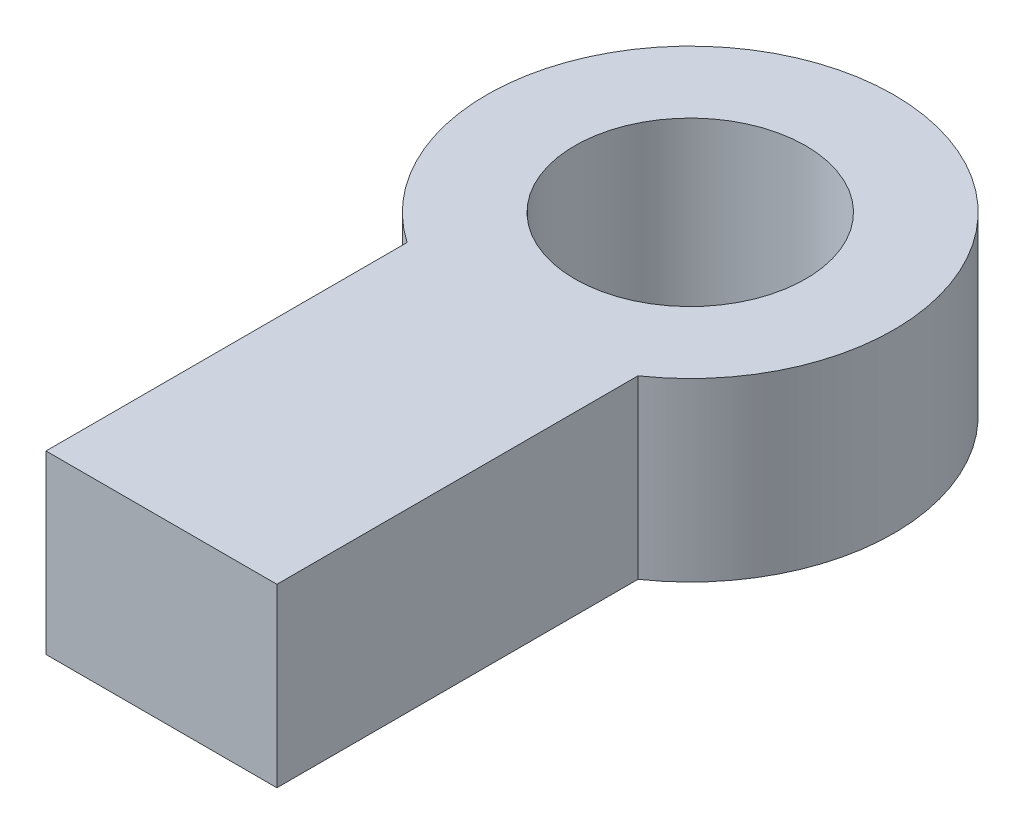
ISO-10303-21;
HEADER;
FILE_DESCRIPTION(('STEP AP214'),'2;1');
FILE_NAME('part.step','',(''),(''),'','','');
FILE_SCHEMA(('AUTOMOTIVE_DESIGN { 1 0 10303 214 1 1 1 1 }'));
ENDSEC;
DATA;
#1=APPLICATION_CONTEXT('core data for automotive mechanical design processes');
#2=APPLICATION_PROTOCOL_DEFINITION('international standard','automotive_design',2000,#1);
#3=PRODUCT_CONTEXT('',#1,'mechanical');
#4=PRODUCT('Part','Part','',(#3));
#5=PRODUCT_RELATED_PRODUCT_CATEGORY('part','',(#4));
#6=PRODUCT_DEFINITION_FORMATION('','',#4);
#7=PRODUCT_DEFINITION_CONTEXT('part definition',#1,'design');
#8=PRODUCT_DEFINITION('design','',#6,#7);
#9=PRODUCT_DEFINITION_SHAPE('','',#8);
#10=(LENGTH_UNIT() NAMED_UNIT(*) SI_UNIT(.MILLI.,.METRE.));
#11=(NAMED_UNIT(*) PLANE_ANGLE_UNIT() SI_UNIT($,.RADIAN.));
#12=(NAMED_UNIT(*) SI_UNIT($,.STERADIAN.) SOLID_ANGLE_UNIT());
#13=UNCERTAINTY_MEASURE_WITH_UNIT(LENGTH_MEASURE(1.E-05),#10,'distance_accuracy_value','');
#14=(GEOMETRIC_REPRESENTATION_CONTEXT(3) GLOBAL_UNCERTAINTY_ASSIGNED_CONTEXT((#13)) GLOBAL_UNIT_ASSIGNED_CONTEXT((#10,
#11,#12)) REPRESENTATION_CONTEXT('',''));
#15=CARTESIAN_POINT('',(0.,0.,0.));
#16=DIRECTION('',(0.,0.,1.));
#17=DIRECTION('',(1.,0.,0.));
#18=AXIS2_PLACEMENT_3D('',#15,#16,#17);
#19=CARTESIAN_POINT('',(0.,5.08,0.));
#20=DIRECTION('',(0.,1.,0.));
#21=DIRECTION('',(0.,0.,1.));
#22=AXIS2_PLACEMENT_3D('',#19,#20,#21);
#23=PLANE('',#22);
#24=CARTESIAN_POINT('',(0.,5.08,0.));
#25=DIRECTION('',(0.,1.,0.));
#26=DIRECTION('',(0.,0.,1.));
#27=AXIS2_PLACEMENT_3D('',#24,#25,#26);
#28=CIRCLE('',#27,3.3274);
#29=CARTESIAN_POINT('',(0.,5.08,3.3274));
#30=VERTEX_POINT('',#29);
#31=EDGE_CURVE('E103',#30,#30,#28,.T.);
#32=ORIENTED_EDGE('',*,*,#31,.F.);
#33=EDGE_LOOP('',(#32));
#34=FACE_BOUND('',#33,.T.);
#35=CARTESIAN_POINT('',(0.,5.08,0.));
#36=DIRECTION('',(0.,1.,0.));
#37=DIRECTION('',(0.,0.,1.));
#38=AXIS2_PLACEMENT_3D('',#35,#36,#37);
#39=CIRCLE('',#38,5.8674);
#40=CARTESIAN_POINT('',(3.3274,5.08,4.83267958797187));
#41=VERTEX_POINT('',#40);
#42=CARTESIAN_POINT('',(-3.3274,5.08,4.83267958797187));
#43=VERTEX_POINT('',#42);
#44=EDGE_CURVE('E11',#41,#43,#39,.T.);
#45=ORIENTED_EDGE('',*,*,#44,.T.);
#46=DIRECTION('',(0.,0.,-1.));
#47=VECTOR('',#46,1.);
#48=CARTESIAN_POINT('',(-3.3274,5.08,0.));
#49=LINE('',#48,#47);
#50=CARTESIAN_POINT('',(-3.3274,5.08,15.24));
#51=VERTEX_POINT('',#50);
#52=EDGE_CURVE('E52',#51,#43,#49,.T.);
#53=ORIENTED_EDGE('',*,*,#52,.F.);
#54=DIRECTION('',(-1.,0.,0.));
#55=VECTOR('',#54,1.);
#56=CARTESIAN_POINT('',(-3.3274,5.08,15.24));
#57=LINE('',#56,#55);
#58=CARTESIAN_POINT('',(3.3274,5.08,15.24));
#59=VERTEX_POINT('',#58);
#60=EDGE_CURVE('E90',#59,#51,#57,.T.);
#61=ORIENTED_EDGE('',*,*,#60,.F.);
#62=DIRECTION('',(0.,0.,1.));
#63=VECTOR('',#62,1.);
#64=CARTESIAN_POINT('',(3.3274,5.08,15.24));
#65=LINE('',#64,#63);
#66=EDGE_CURVE('E79',#41,#59,#65,.T.);
#67=ORIENTED_EDGE('',*,*,#66,.F.);
#68=EDGE_LOOP('',(#45,#53,#61,#67));
#69=FACE_BOUND('',#68,.T.);
#70=ADVANCED_FACE('F36',(#34,#69),#23,.T.);
#71=CARTESIAN_POINT('',(0.,0.,0.));
#72=DIRECTION('',(0.,1.,0.));
#73=DIRECTION('',(0.,0.,1.));
#74=AXIS2_PLACEMENT_3D('',#71,#72,#73);
#75=PLANE('',#74);
#76=CARTESIAN_POINT('',(0.,0.,0.));
#77=DIRECTION('',(0.,1.,0.));
#78=DIRECTION('',(0.,0.,1.));
#79=AXIS2_PLACEMENT_3D('',#76,#77,#78);
#80=CIRCLE('',#79,5.8674);
#81=CARTESIAN_POINT('',(3.3274,0.,4.83267958797188));
#82=VERTEX_POINT('',#81);
#83=CARTESIAN_POINT('',(-3.3274,0.,4.83267958797187));
#84=VERTEX_POINT('',#83);
#85=EDGE_CURVE('E45',#82,#84,#80,.T.);
#86=ORIENTED_EDGE('',*,*,#85,.F.);
#87=DIRECTION('',(0.,0.,1.));
#88=VECTOR('',#87,1.);
#89=CARTESIAN_POINT('',(3.3274,0.,15.24));
#90=LINE('',#89,#88);
#91=CARTESIAN_POINT('',(3.3274,0.,15.24));
#92=VERTEX_POINT('',#91);
#93=EDGE_CURVE('E62',#82,#92,#90,.T.);
#94=ORIENTED_EDGE('',*,*,#93,.T.);
#95=DIRECTION('',(-1.,0.,0.));
#96=VECTOR('',#95,1.);
#97=CARTESIAN_POINT('',(-3.3274,0.,15.24));
#98=LINE('',#97,#96);
#99=CARTESIAN_POINT('',(-3.3274,0.,15.24));
#100=VERTEX_POINT('',#99);
#101=EDGE_CURVE('E92',#92,#100,#98,.T.);
#102=ORIENTED_EDGE('',*,*,#101,.T.);
#103=DIRECTION('',(0.,0.,-1.));
#104=VECTOR('',#103,1.);
#105=CARTESIAN_POINT('',(-3.3274,0.,0.));
#106=LINE('',#105,#104);
#107=EDGE_CURVE('E88',#100,#84,#106,.T.);
#108=ORIENTED_EDGE('',*,*,#107,.T.);
#109=EDGE_LOOP('',(#86,#94,#102,#108));
#110=FACE_BOUND('',#109,.T.);
#111=CARTESIAN_POINT('',(0.,0.,0.));
#112=DIRECTION('',(0.,1.,0.));
#113=DIRECTION('',(0.,0.,1.));
#114=AXIS2_PLACEMENT_3D('',#111,#112,#113);
#115=CIRCLE('',#114,3.3274);
#116=CARTESIAN_POINT('',(0.,0.,3.3274));
#117=VERTEX_POINT('',#116);
#118=EDGE_CURVE('E105',#117,#117,#115,.T.);
#119=ORIENTED_EDGE('',*,*,#118,.T.);
#120=EDGE_LOOP('',(#119));
#121=FACE_BOUND('',#120,.T.);
#122=ADVANCED_FACE('F108',(#110,#121),#75,.F.);
#123=CARTESIAN_POINT('',(0.,5.08,0.));
#124=DIRECTION('',(0.,-1.,0.));
#125=DIRECTION('',(0.,0.,-1.));
#126=AXIS2_PLACEMENT_3D('',#123,#124,#125);
#127=CYLINDRICAL_SURFACE('',#126,5.8674);
#128=ORIENTED_EDGE('',*,*,#44,.F.);
#129=DIRECTION('',(0.,-1.,0.));
#130=VECTOR('',#129,1.);
#131=CARTESIAN_POINT('',(3.3274,5.08,4.83267958797187));
#132=LINE('',#131,#130);
#133=EDGE_CURVE('E83',#41,#82,#132,.T.);
#134=ORIENTED_EDGE('',*,*,#133,.T.);
#135=ORIENTED_EDGE('',*,*,#85,.T.);
#136=DIRECTION('',(0.,-1.,0.));
#137=VECTOR('',#136,1.);
#138=CARTESIAN_POINT('',(-3.3274,5.08,4.83267958797187));
#139=LINE('',#138,#137);
#140=EDGE_CURVE('E97',#84,#43,#139,.F.);
#141=ORIENTED_EDGE('',*,*,#140,.T.);
#142=EDGE_LOOP('',(#128,#134,#135,#141));
#143=FACE_BOUND('',#142,.T.);
#144=ADVANCED_FACE('F37',(#143),#127,.T.);
#145=CARTESIAN_POINT('',(0.,5.08,0.));
#146=DIRECTION('',(0.,-1.,0.));
#147=DIRECTION('',(0.,0.,-1.));
#148=AXIS2_PLACEMENT_3D('',#145,#146,#147);
#149=CYLINDRICAL_SURFACE('',#148,3.3274);
#150=ORIENTED_EDGE('',*,*,#118,.F.);
#151=EDGE_LOOP('',(#150));
#152=FACE_BOUND('',#151,.T.);
#153=ORIENTED_EDGE('',*,*,#31,.T.);
#154=EDGE_LOOP('',(#153));
#155=FACE_BOUND('',#154,.T.);
#156=ADVANCED_FACE('F112',(#152,#155),#149,.F.);
#157=CARTESIAN_POINT('',(3.3274,21.7096110309291,15.24));
#158=DIRECTION('',(1.,0.,0.));
#159=DIRECTION('',(0.,0.,-1.));
#160=AXIS2_PLACEMENT_3D('',#157,#158,#159);
#161=PLANE('',#160);
#162=ORIENTED_EDGE('',*,*,#133,.F.);
#163=ORIENTED_EDGE('',*,*,#66,.T.);
#164=DIRECTION('',(0.,-1.,0.));
#165=VECTOR('',#164,1.);
#166=CARTESIAN_POINT('',(3.3274,21.7096110309291,15.24));
#167=LINE('',#166,#165);
#168=EDGE_CURVE('E82',#59,#92,#167,.T.);
#169=ORIENTED_EDGE('',*,*,#168,.T.);
#170=ORIENTED_EDGE('',*,*,#93,.F.);
#171=EDGE_LOOP('',(#162,#163,#169,#170));
#172=FACE_BOUND('',#171,.T.);
#173=ADVANCED_FACE('F76',(#172),#161,.T.);
#174=CARTESIAN_POINT('',(-3.3274,21.7096110309291,0.));
#175=DIRECTION('',(-1.,0.,0.));
#176=DIRECTION('',(0.,0.,1.));
#177=AXIS2_PLACEMENT_3D('',#174,#175,#176);
#178=PLANE('',#177);
#179=ORIENTED_EDGE('',*,*,#140,.F.);
#180=ORIENTED_EDGE('',*,*,#107,.F.);
#181=DIRECTION('',(0.,-1.,0.));
#182=VECTOR('',#181,1.);
#183=CARTESIAN_POINT('',(-3.3274,21.7096110309291,15.24));
#184=LINE('',#183,#182);
#185=EDGE_CURVE('E93',#51,#100,#184,.T.);
#186=ORIENTED_EDGE('',*,*,#185,.F.);
#187=ORIENTED_EDGE('',*,*,#52,.T.);
#188=EDGE_LOOP('',(#179,#180,#186,#187));
#189=FACE_BOUND('',#188,.T.);
#190=ADVANCED_FACE('F127',(#189),#178,.T.);
#191=CARTESIAN_POINT('',(-3.3274,21.7096110309291,15.24));
#192=DIRECTION('',(0.,0.,1.));
#193=DIRECTION('',(1.,0.,0.));
#194=AXIS2_PLACEMENT_3D('',#191,#192,#193);
#195=PLANE('',#194);
#196=ORIENTED_EDGE('',*,*,#168,.F.);
#197=ORIENTED_EDGE('',*,*,#60,.T.);
#198=ORIENTED_EDGE('',*,*,#185,.T.);
#199=ORIENTED_EDGE('',*,*,#101,.F.);
#200=EDGE_LOOP('',(#196,#197,#198,#199));
#201=FACE_BOUND('',#200,.T.);
#202=ADVANCED_FACE('F91',(#201),#195,.T.);
#203=CLOSED_SHELL('',(#70,#122,#144,#156,#173,#190,#202));
#204=MANIFOLD_SOLID_BREP('B2',#203);
#205=ADVANCED_BREP_SHAPE_REPRESENTATION('',(#18,#204),#14);
#206=SHAPE_DEFINITION_REPRESENTATION(#9,#205);
ENDSEC;
END-ISO-10303-21;
